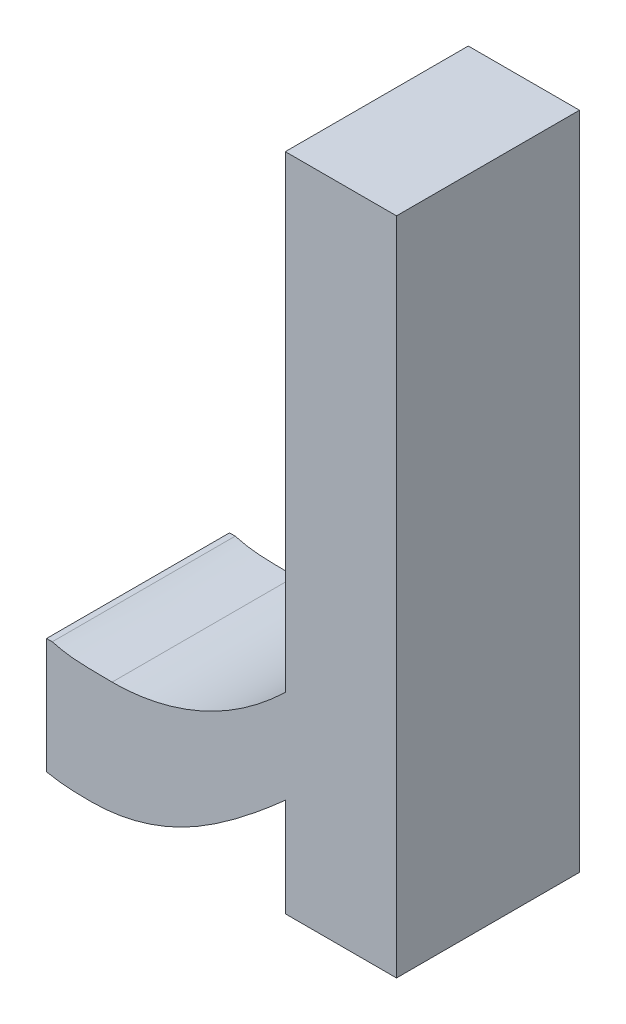
ISO-10303-21;
HEADER;
FILE_DESCRIPTION(('STEP AP214'),'2;1');
FILE_NAME('part.step','',(''),(''),'','','');
FILE_SCHEMA(('AUTOMOTIVE_DESIGN { 1 0 10303 214 1 1 1 1 }'));
ENDSEC;
DATA;
#1=APPLICATION_CONTEXT('core data for automotive mechanical design processes');
#2=APPLICATION_PROTOCOL_DEFINITION('international standard','automotive_design',2000,#1);
#3=PRODUCT_CONTEXT('',#1,'mechanical');
#4=PRODUCT('Part','Part','',(#3));
#5=PRODUCT_RELATED_PRODUCT_CATEGORY('part','',(#4));
#6=PRODUCT_DEFINITION_FORMATION('','',#4);
#7=PRODUCT_DEFINITION_CONTEXT('part definition',#1,'design');
#8=PRODUCT_DEFINITION('design','',#6,#7);
#9=PRODUCT_DEFINITION_SHAPE('','',#8);
#10=(LENGTH_UNIT() NAMED_UNIT(*) SI_UNIT(.MILLI.,.METRE.));
#11=(NAMED_UNIT(*) PLANE_ANGLE_UNIT() SI_UNIT($,.RADIAN.));
#12=(NAMED_UNIT(*) SI_UNIT($,.STERADIAN.) SOLID_ANGLE_UNIT());
#13=UNCERTAINTY_MEASURE_WITH_UNIT(LENGTH_MEASURE(1.E-05),#10,'distance_accuracy_value','');
#14=(GEOMETRIC_REPRESENTATION_CONTEXT(3) GLOBAL_UNCERTAINTY_ASSIGNED_CONTEXT((#13)) GLOBAL_UNIT_ASSIGNED_CONTEXT((#10,
#11,#12)) REPRESENTATION_CONTEXT('',''));
#15=CARTESIAN_POINT('',(0.,0.,0.));
#16=DIRECTION('',(0.,0.,1.));
#17=DIRECTION('',(1.,0.,0.));
#18=AXIS2_PLACEMENT_3D('',#15,#16,#17);
#19=CARTESIAN_POINT('',(-7.146569694468,-7.805310024976,0.));
#20=CARTESIAN_POINT('',(-7.146569694468,-7.805310024976,0.1));
#21=CARTESIAN_POINT('',(-7.157088081995,-7.805310024976,0.));
#22=CARTESIAN_POINT('',(-7.157088081995,-7.805310024976,0.1));
#23=CARTESIAN_POINT('',(-7.172281308424,-7.804530885159,0.));
#24=CARTESIAN_POINT('',(-7.172281308424,-7.804530885159,0.1));
#25=CARTESIAN_POINT('',(-7.179293566776,-7.802583035617,0.));
#26=CARTESIAN_POINT('',(-7.179293566776,-7.802583035617,0.1));
#27=B_SPLINE_SURFACE_WITH_KNOTS('',2,1,((#19,#20),(#21,#22),(#23,#24),(#25,#26)),.UNSPECIFIED.,
.F.,.F.,.F.,(3,1,3),(2,2),(-2.,-1.,0.),(0.,0.01),.UNSPECIFIED.);
#28=CARTESIAN_POINT('',(-7.179293566776,-7.802583035617,0.));
#29=CARTESIAN_POINT('',(-7.172281308424,-7.804530885159,0.));
#30=CARTESIAN_POINT('',(-7.157088081995,-7.805310024976,0.));
#31=CARTESIAN_POINT('',(-7.146569694468,-7.805310024976,0.));
#32=B_SPLINE_CURVE_WITH_KNOTS('',2,(#28,#29,#30,#31),.UNSPECIFIED.,.F.,.F.,(3,1,3),(0.,1.,2.),.UNSPECIFIED.);
#33=CARTESIAN_POINT('',(-7.179293566776,-7.802583035617,0.));
#34=VERTEX_POINT('',#33);
#35=CARTESIAN_POINT('',(-7.146569694468,-7.805310024976,0.));
#36=VERTEX_POINT('',#35);
#37=EDGE_CURVE('E11',#34,#36,#32,.T.);
#38=DIRECTION('',(0.,0.,1.));
#39=VECTOR('',#38,1.);
#40=CARTESIAN_POINT('',(-7.179293566776,-7.802583035617,0.));
#41=LINE('',#40,#39);
#42=CARTESIAN_POINT('',(-7.179293566776,-7.802583035617,0.1));
#43=VERTEX_POINT('',#42);
#44=EDGE_CURVE('E28',#34,#43,#41,.T.);
#45=CARTESIAN_POINT('',(-7.146569694468,-7.805310024976,0.1));
#46=CARTESIAN_POINT('',(-7.157088081995,-7.805310024976,0.1));
#47=CARTESIAN_POINT('',(-7.172281308424,-7.804530885159,0.1));
#48=CARTESIAN_POINT('',(-7.179293566776,-7.802583035617,0.1));
#49=B_SPLINE_CURVE_WITH_KNOTS('',2,(#45,#46,#47,#48),.UNSPECIFIED.,.F.,.F.,(3,1,3),(-2.,-1.,0.),.UNSPECIFIED.);
#50=CARTESIAN_POINT('',(-7.146569694468,-7.805310024976,0.1));
#51=VERTEX_POINT('',#50);
#52=EDGE_CURVE('E122',#51,#43,#49,.T.);
#53=DIRECTION('',(0.,0.,1.));
#54=VECTOR('',#53,1.);
#55=CARTESIAN_POINT('',(-7.146569694468,-7.805310024976,0.));
#56=LINE('',#55,#54);
#57=EDGE_CURVE('E214',#36,#51,#56,.T.);
#58=ORIENTED_EDGE('',*,*,#37,.F.);
#59=ORIENTED_EDGE('',*,*,#44,.T.);
#60=ORIENTED_EDGE('',*,*,#52,.F.);
#61=ORIENTED_EDGE('',*,*,#57,.F.);
#62=EDGE_LOOP('',(#58,#59,#60,#61));
#63=FACE_BOUND('',#62,.T.);
#64=ADVANCED_FACE('F17',(#63),#27,.T.);
#65=CARTESIAN_POINT('',(-7.051904206719,-7.762846904957,0.));
#66=CARTESIAN_POINT('',(-7.051904206719,-7.762846904957,0.1));
#67=CARTESIAN_POINT('',(-7.073720121591,-7.783883680012,0.));
#68=CARTESIAN_POINT('',(-7.073720121591,-7.783883680012,0.1));
#69=CARTESIAN_POINT('',(-7.122026790236,-7.805310024976,0.));
#70=CARTESIAN_POINT('',(-7.122026790236,-7.805310024976,0.1));
#71=CARTESIAN_POINT('',(-7.146569694468,-7.805310024976,0.));
#72=CARTESIAN_POINT('',(-7.146569694468,-7.805310024976,0.1));
#73=B_SPLINE_SURFACE_WITH_KNOTS('',2,1,((#65,#66),(#67,#68),(#69,#70),(#71,#72)),.UNSPECIFIED.,
.F.,.F.,.F.,(3,1,3),(2,2),(-2.,-1.,0.),(0.,0.01),.UNSPECIFIED.);
#74=CARTESIAN_POINT('',(-7.146569694468,-7.805310024976,0.));
#75=CARTESIAN_POINT('',(-7.122026790236,-7.805310024976,0.));
#76=CARTESIAN_POINT('',(-7.073720121591,-7.783883680012,0.));
#77=CARTESIAN_POINT('',(-7.051904206719,-7.762846904957,0.));
#78=B_SPLINE_CURVE_WITH_KNOTS('',2,(#74,#75,#76,#77),.UNSPECIFIED.,.F.,.F.,(3,1,3),(0.,1.,2.),.UNSPECIFIED.);
#79=CARTESIAN_POINT('',(-7.051904206719,-7.762846904957,0.));
#80=VERTEX_POINT('',#79);
#81=EDGE_CURVE('E207',#36,#80,#78,.T.);
#82=CARTESIAN_POINT('',(-7.051904206719,-7.762846904957,0.1));
#83=CARTESIAN_POINT('',(-7.073720121591,-7.783883680012,0.1));
#84=CARTESIAN_POINT('',(-7.122026790236,-7.805310024976,0.1));
#85=CARTESIAN_POINT('',(-7.146569694468,-7.805310024976,0.1));
#86=B_SPLINE_CURVE_WITH_KNOTS('',2,(#82,#83,#84,#85),.UNSPECIFIED.,.F.,.F.,(3,1,3),(-2.,-1.,0.),.UNSPECIFIED.);
#87=CARTESIAN_POINT('',(-7.051904206719,-7.762846904957,0.1));
#88=VERTEX_POINT('',#87);
#89=EDGE_CURVE('E203',#88,#51,#86,.T.);
#90=DIRECTION('',(0.,0.,1.));
#91=VECTOR('',#90,1.);
#92=CARTESIAN_POINT('',(-7.051904206719,-7.762846904957,0.));
#93=LINE('',#92,#91);
#94=EDGE_CURVE('E200',#80,#88,#93,.T.);
#95=ORIENTED_EDGE('',*,*,#81,.F.);
#96=ORIENTED_EDGE('',*,*,#57,.T.);
#97=ORIENTED_EDGE('',*,*,#89,.F.);
#98=ORIENTED_EDGE('',*,*,#94,.F.);
#99=EDGE_LOOP('',(#95,#96,#97,#98));
#100=FACE_BOUND('',#99,.T.);
#101=ADVANCED_FACE('F256',(#100),#73,.T.);
#102=CARTESIAN_POINT('',(-7.051904206719,-7.506899475119,0.));
#103=DIRECTION('',(-1.,0.,0.));
#104=DIRECTION('',(0.,-1.,0.));
#105=AXIS2_PLACEMENT_3D('',#102,#103,#104);
#106=PLANE('',#105);
#107=DIRECTION('',(0.,1.,0.));
#108=VECTOR('',#107,1.);
#109=CARTESIAN_POINT('',(-7.051904206719,-7.762846904957,0.));
#110=LINE('',#109,#108);
#111=CARTESIAN_POINT('',(-7.051904206719,-7.506899475119,0.));
#112=VERTEX_POINT('',#111);
#113=EDGE_CURVE('E198',#80,#112,#110,.T.);
#114=ORIENTED_EDGE('',*,*,#113,.F.);
#115=ORIENTED_EDGE('',*,*,#94,.T.);
#116=DIRECTION('',(0.,-1.,0.));
#117=VECTOR('',#116,1.);
#118=CARTESIAN_POINT('',(-7.051904206719,-7.762846904957,0.1));
#119=LINE('',#118,#117);
#120=CARTESIAN_POINT('',(-7.051904206719,-7.506899475119,0.1));
#121=VERTEX_POINT('',#120);
#122=EDGE_CURVE('E195',#121,#88,#119,.T.);
#123=ORIENTED_EDGE('',*,*,#122,.F.);
#124=DIRECTION('',(0.,0.,1.));
#125=VECTOR('',#124,1.);
#126=CARTESIAN_POINT('',(-7.051904206719,-7.506899475119,0.));
#127=LINE('',#126,#125);
#128=EDGE_CURVE('E192',#112,#121,#127,.T.);
#129=ORIENTED_EDGE('',*,*,#128,.F.);
#130=EDGE_LOOP('',(#114,#115,#123,#129));
#131=FACE_BOUND('',#130,.T.);
#132=ADVANCED_FACE('F252',(#131),#106,.T.);
#133=CARTESIAN_POINT('',(-6.991131301004,-7.506899475119,0.));
#134=DIRECTION('',(0.,1.,0.));
#135=DIRECTION('',(-1.,0.,0.));
#136=AXIS2_PLACEMENT_3D('',#133,#134,#135);
#137=PLANE('',#136);
#138=DIRECTION('',(1.,0.,0.));
#139=VECTOR('',#138,1.);
#140=CARTESIAN_POINT('',(-7.051904206719,-7.506899475119,0.));
#141=LINE('',#140,#139);
#142=CARTESIAN_POINT('',(-6.991131301004,-7.506899475119,0.));
#143=VERTEX_POINT('',#142);
#144=EDGE_CURVE('E190',#112,#143,#141,.T.);
#145=ORIENTED_EDGE('',*,*,#144,.F.);
#146=ORIENTED_EDGE('',*,*,#128,.T.);
#147=DIRECTION('',(-1.,0.,0.));
#148=VECTOR('',#147,1.);
#149=CARTESIAN_POINT('',(-7.051904206719,-7.506899475119,0.1));
#150=LINE('',#149,#148);
#151=CARTESIAN_POINT('',(-6.991131301004,-7.506899475119,0.1));
#152=VERTEX_POINT('',#151);
#153=EDGE_CURVE('E187',#152,#121,#150,.T.);
#154=ORIENTED_EDGE('',*,*,#153,.F.);
#155=DIRECTION('',(0.,0.,1.));
#156=VECTOR('',#155,1.);
#157=CARTESIAN_POINT('',(-6.991131301004,-7.506899475119,0.));
#158=LINE('',#157,#156);
#159=EDGE_CURVE('E184',#143,#152,#158,.T.);
#160=ORIENTED_EDGE('',*,*,#159,.F.);
#161=EDGE_LOOP('',(#145,#146,#154,#160));
#162=FACE_BOUND('',#161,.T.);
#163=ADVANCED_FACE('F248',(#162),#137,.T.);
#164=CARTESIAN_POINT('',(-6.991131301004,-7.867641210324,0.));
#165=DIRECTION('',(1.,0.,0.));
#166=DIRECTION('',(0.,1.,0.));
#167=AXIS2_PLACEMENT_3D('',#164,#165,#166);
#168=PLANE('',#167);
#169=DIRECTION('',(0.,-1.,0.));
#170=VECTOR('',#169,1.);
#171=CARTESIAN_POINT('',(-6.991131301004,-7.506899475119,0.));
#172=LINE('',#171,#170);
#173=CARTESIAN_POINT('',(-6.991131301004,-7.867641210324,0.));
#174=VERTEX_POINT('',#173);
#175=EDGE_CURVE('E182',#143,#174,#172,.T.);
#176=ORIENTED_EDGE('',*,*,#175,.F.);
#177=ORIENTED_EDGE('',*,*,#159,.T.);
#178=DIRECTION('',(0.,1.,0.));
#179=VECTOR('',#178,1.);
#180=CARTESIAN_POINT('',(-6.991131301004,-7.506899475119,0.1));
#181=LINE('',#180,#179);
#182=CARTESIAN_POINT('',(-6.991131301004,-7.867641210324,0.1));
#183=VERTEX_POINT('',#182);
#184=EDGE_CURVE('E179',#183,#152,#181,.T.);
#185=ORIENTED_EDGE('',*,*,#184,.F.);
#186=DIRECTION('',(0.,0.,1.));
#187=VECTOR('',#186,1.);
#188=CARTESIAN_POINT('',(-6.991131301004,-7.867641210324,0.));
#189=LINE('',#188,#187);
#190=EDGE_CURVE('E176',#174,#183,#189,.T.);
#191=ORIENTED_EDGE('',*,*,#190,.F.);
#192=EDGE_LOOP('',(#176,#177,#185,#191));
#193=FACE_BOUND('',#192,.T.);
#194=ADVANCED_FACE('F244',(#193),#168,.T.);
#195=CARTESIAN_POINT('',(-7.051904206719,-7.867641210324,0.));
#196=DIRECTION('',(0.,-1.,0.));
#197=DIRECTION('',(1.,0.,0.));
#198=AXIS2_PLACEMENT_3D('',#195,#196,#197);
#199=PLANE('',#198);
#200=DIRECTION('',(-1.,0.,0.));
#201=VECTOR('',#200,1.);
#202=CARTESIAN_POINT('',(-6.991131301004,-7.867641210324,0.));
#203=LINE('',#202,#201);
#204=CARTESIAN_POINT('',(-7.051904206719,-7.867641210324,0.));
#205=VERTEX_POINT('',#204);
#206=EDGE_CURVE('E174',#174,#205,#203,.T.);
#207=ORIENTED_EDGE('',*,*,#206,.F.);
#208=ORIENTED_EDGE('',*,*,#190,.T.);
#209=DIRECTION('',(1.,0.,0.));
#210=VECTOR('',#209,1.);
#211=CARTESIAN_POINT('',(-6.991131301004,-7.867641210324,0.1));
#212=LINE('',#211,#210);
#213=CARTESIAN_POINT('',(-7.051904206719,-7.867641210324,0.1));
#214=VERTEX_POINT('',#213);
#215=EDGE_CURVE('E171',#214,#183,#212,.T.);
#216=ORIENTED_EDGE('',*,*,#215,.F.);
#217=DIRECTION('',(0.,0.,1.));
#218=VECTOR('',#217,1.);
#219=CARTESIAN_POINT('',(-7.051904206719,-7.867641210324,0.));
#220=LINE('',#219,#218);
#221=EDGE_CURVE('E168',#205,#214,#220,.T.);
#222=ORIENTED_EDGE('',*,*,#221,.F.);
#223=EDGE_LOOP('',(#207,#208,#216,#222));
#224=FACE_BOUND('',#223,.T.);
#225=ADVANCED_FACE('F240',(#224),#199,.T.);
#226=CARTESIAN_POINT('',(-7.051904206719,-7.813880562961,0.));
#227=DIRECTION('',(-1.,0.,0.));
#228=DIRECTION('',(0.,-1.,0.));
#229=AXIS2_PLACEMENT_3D('',#226,#227,#228);
#230=PLANE('',#229);
#231=DIRECTION('',(0.,1.,0.));
#232=VECTOR('',#231,1.);
#233=CARTESIAN_POINT('',(-7.051904206719,-7.867641210324,0.));
#234=LINE('',#233,#232);
#235=CARTESIAN_POINT('',(-7.051904206719,-7.813880562961,0.));
#236=VERTEX_POINT('',#235);
#237=EDGE_CURVE('E166',#205,#236,#234,.T.);
#238=ORIENTED_EDGE('',*,*,#237,.F.);
#239=ORIENTED_EDGE('',*,*,#221,.T.);
#240=DIRECTION('',(0.,-1.,0.));
#241=VECTOR('',#240,1.);
#242=CARTESIAN_POINT('',(-7.051904206719,-7.867641210324,0.1));
#243=LINE('',#242,#241);
#244=CARTESIAN_POINT('',(-7.051904206719,-7.813880562961,0.1));
#245=VERTEX_POINT('',#244);
#246=EDGE_CURVE('E163',#245,#214,#243,.T.);
#247=ORIENTED_EDGE('',*,*,#246,.F.);
#248=DIRECTION('',(0.,0.,1.));
#249=VECTOR('',#248,1.);
#250=CARTESIAN_POINT('',(-7.051904206719,-7.813880562961,0.));
#251=LINE('',#250,#249);
#252=EDGE_CURVE('E157',#236,#245,#251,.T.);
#253=ORIENTED_EDGE('',*,*,#252,.F.);
#254=EDGE_LOOP('',(#238,#239,#247,#253));
#255=FACE_BOUND('',#254,.T.);
#256=ADVANCED_FACE('F236',(#255),#230,.T.);
#257=CARTESIAN_POINT('',(-7.157867221812,-7.867641210324,0.));
#258=CARTESIAN_POINT('',(-7.157867221812,-7.867641210324,0.1));
#259=CARTESIAN_POINT('',(-7.134493027306,-7.867641210324,0.));
#260=CARTESIAN_POINT('',(-7.134493027306,-7.867641210324,0.1));
#261=CARTESIAN_POINT('',(-7.085017648936,-7.843487876002,0.));
#262=CARTESIAN_POINT('',(-7.085017648936,-7.843487876002,0.1));
#263=CARTESIAN_POINT('',(-7.051904206719,-7.813880562961,0.));
#264=CARTESIAN_POINT('',(-7.051904206719,-7.813880562961,0.1));
#265=B_SPLINE_SURFACE_WITH_KNOTS('',2,1,((#257,#258),(#259,#260),(#261,#262),(#263,#264)),
.UNSPECIFIED.,.F.,.F.,.F.,(3,1,3),(2,2),(-2.,-1.,0.),(0.,0.01),.UNSPECIFIED.);
#266=CARTESIAN_POINT('',(-7.051904206719,-7.813880562961,0.));
#267=CARTESIAN_POINT('',(-7.085017648936,-7.843487876002,0.));
#268=CARTESIAN_POINT('',(-7.134493027306,-7.867641210324,0.));
#269=CARTESIAN_POINT('',(-7.157867221812,-7.867641210324,0.));
#270=B_SPLINE_CURVE_WITH_KNOTS('',2,(#266,#267,#268,#269),.UNSPECIFIED.,.F.,.F.,(3,1,3),(0.,1.,
2.),.UNSPECIFIED.);
#271=CARTESIAN_POINT('',(-7.157867221812,-7.867641210324,0.));
#272=VERTEX_POINT('',#271);
#273=EDGE_CURVE('E150',#236,#272,#270,.T.);
#274=CARTESIAN_POINT('',(-7.157867221812,-7.867641210324,0.1));
#275=CARTESIAN_POINT('',(-7.134493027306,-7.867641210324,0.1));
#276=CARTESIAN_POINT('',(-7.085017648936,-7.843487876002,0.1));
#277=CARTESIAN_POINT('',(-7.051904206719,-7.813880562961,0.1));
#278=B_SPLINE_CURVE_WITH_KNOTS('',2,(#274,#275,#276,#277),.UNSPECIFIED.,.F.,.F.,(3,1,3),(-2.,
-1.,0.),.UNSPECIFIED.);
#279=CARTESIAN_POINT('',(-7.157867221812,-7.867641210324,0.1));
#280=VERTEX_POINT('',#279);
#281=EDGE_CURVE('E145',#280,#245,#278,.T.);
#282=DIRECTION('',(0.,0.,1.));
#283=VECTOR('',#282,1.);
#284=CARTESIAN_POINT('',(-7.157867221812,-7.867641210324,0.));
#285=LINE('',#284,#283);
#286=EDGE_CURVE('E139',#272,#280,#285,.T.);
#287=ORIENTED_EDGE('',*,*,#273,.F.);
#288=ORIENTED_EDGE('',*,*,#252,.T.);
#289=ORIENTED_EDGE('',*,*,#281,.F.);
#290=ORIENTED_EDGE('',*,*,#286,.F.);
#291=EDGE_LOOP('',(#287,#288,#289,#290));
#292=FACE_BOUND('',#291,.T.);
#293=ADVANCED_FACE('F232',(#292),#265,.T.);
#294=CARTESIAN_POINT('',(-7.182410126043,-7.865693360782,0.));
#295=CARTESIAN_POINT('',(-7.182410126043,-7.865693360782,0.1));
#296=CARTESIAN_POINT('',(-7.176566577417,-7.866862070508,0.));
#297=CARTESIAN_POINT('',(-7.176566577417,-7.866862070508,0.1));
#298=CARTESIAN_POINT('',(-7.167216899614,-7.867641210324,0.));
#299=CARTESIAN_POINT('',(-7.167216899614,-7.867641210324,0.1));
#300=CARTESIAN_POINT('',(-7.157867221812,-7.867641210324,0.));
#301=CARTESIAN_POINT('',(-7.157867221812,-7.867641210324,0.1));
#302=B_SPLINE_SURFACE_WITH_KNOTS('',2,1,((#294,#295),(#296,#297),(#298,#299),(#300,#301)),
.UNSPECIFIED.,.F.,.F.,.F.,(3,1,3),(2,2),(-2.,-1.,0.),(0.,0.01),.UNSPECIFIED.);
#303=CARTESIAN_POINT('',(-7.157867221812,-7.867641210324,0.));
#304=CARTESIAN_POINT('',(-7.167216899614,-7.867641210324,0.));
#305=CARTESIAN_POINT('',(-7.176566577417,-7.866862070508,0.));
#306=CARTESIAN_POINT('',(-7.182410126043,-7.865693360782,0.));
#307=B_SPLINE_CURVE_WITH_KNOTS('',2,(#303,#304,#305,#306),.UNSPECIFIED.,.F.,.F.,(3,1,3),(0.,1.,
2.),.UNSPECIFIED.);
#308=CARTESIAN_POINT('',(-7.182410126043,-7.865693360782,0.));
#309=VERTEX_POINT('',#308);
#310=EDGE_CURVE('E132',#272,#309,#307,.T.);
#311=CARTESIAN_POINT('',(-7.182410126043,-7.865693360782,0.1));
#312=CARTESIAN_POINT('',(-7.176566577417,-7.866862070508,0.1));
#313=CARTESIAN_POINT('',(-7.167216899614,-7.867641210324,0.1));
#314=CARTESIAN_POINT('',(-7.157867221812,-7.867641210324,0.1));
#315=B_SPLINE_CURVE_WITH_KNOTS('',2,(#311,#312,#313,#314),.UNSPECIFIED.,.F.,.F.,(3,1,3),(-2.,
-1.,0.),.UNSPECIFIED.);
#316=CARTESIAN_POINT('',(-7.182410126043,-7.865693360782,0.1));
#317=VERTEX_POINT('',#316);
#318=EDGE_CURVE('E128',#317,#280,#315,.T.);
#319=DIRECTION('',(0.,0.,1.));
#320=VECTOR('',#319,1.);
#321=CARTESIAN_POINT('',(-7.182410126043,-7.865693360782,0.));
#322=LINE('',#321,#320);
#323=EDGE_CURVE('E107',#309,#317,#322,.T.);
#324=ORIENTED_EDGE('',*,*,#310,.F.);
#325=ORIENTED_EDGE('',*,*,#286,.T.);
#326=ORIENTED_EDGE('',*,*,#318,.F.);
#327=ORIENTED_EDGE('',*,*,#323,.F.);
#328=EDGE_LOOP('',(#324,#325,#326,#327));
#329=FACE_BOUND('',#328,.T.);
#330=ADVANCED_FACE('F230',(#329),#302,.T.);
#331=CARTESIAN_POINT('',(-7.182410126043,-7.802583035617,0.));
#332=DIRECTION('',(-1.,0.,0.));
#333=DIRECTION('',(0.,-1.,0.));
#334=AXIS2_PLACEMENT_3D('',#331,#332,#333);
#335=PLANE('',#334);
#336=DIRECTION('',(0.,1.,0.));
#337=VECTOR('',#336,1.);
#338=CARTESIAN_POINT('',(-7.182410126043,-7.865693360782,0.));
#339=LINE('',#338,#337);
#340=CARTESIAN_POINT('',(-7.182410126043,-7.802583035617,0.));
#341=VERTEX_POINT('',#340);
#342=EDGE_CURVE('E111',#309,#341,#339,.T.);
#343=ORIENTED_EDGE('',*,*,#342,.F.);
#344=ORIENTED_EDGE('',*,*,#323,.T.);
#345=DIRECTION('',(0.,-1.,0.));
#346=VECTOR('',#345,1.);
#347=CARTESIAN_POINT('',(-7.182410126043,-7.865693360782,0.1));
#348=LINE('',#347,#346);
#349=CARTESIAN_POINT('',(-7.182410126043,-7.802583035617,0.1));
#350=VERTEX_POINT('',#349);
#351=EDGE_CURVE('E100',#350,#317,#348,.T.);
#352=ORIENTED_EDGE('',*,*,#351,.F.);
#353=DIRECTION('',(0.,0.,1.));
#354=VECTOR('',#353,1.);
#355=CARTESIAN_POINT('',(-7.182410126043,-7.802583035617,0.));
#356=LINE('',#355,#354);
#357=EDGE_CURVE('E104',#341,#350,#356,.T.);
#358=ORIENTED_EDGE('',*,*,#357,.F.);
#359=EDGE_LOOP('',(#343,#344,#352,#358));
#360=FACE_BOUND('',#359,.T.);
#361=ADVANCED_FACE('F103',(#360),#335,.T.);
#362=CARTESIAN_POINT('',(-7.179293566776,-7.802583035617,0.));
#363=DIRECTION('',(0.,1.,0.));
#364=DIRECTION('',(-1.,0.,0.));
#365=AXIS2_PLACEMENT_3D('',#362,#363,#364);
#366=PLANE('',#365);
#367=DIRECTION('',(1.,0.,0.));
#368=VECTOR('',#367,1.);
#369=CARTESIAN_POINT('',(-7.182410126043,-7.802583035617,0.));
#370=LINE('',#369,#368);
#371=EDGE_CURVE('E117',#341,#34,#370,.T.);
#372=ORIENTED_EDGE('',*,*,#371,.F.);
#373=ORIENTED_EDGE('',*,*,#357,.T.);
#374=DIRECTION('',(-1.,0.,0.));
#375=VECTOR('',#374,1.);
#376=CARTESIAN_POINT('',(-7.182410126043,-7.802583035617,0.1));
#377=LINE('',#376,#375);
#378=EDGE_CURVE('E116',#43,#350,#377,.T.);
#379=ORIENTED_EDGE('',*,*,#378,.F.);
#380=ORIENTED_EDGE('',*,*,#44,.F.);
#381=EDGE_LOOP('',(#372,#373,#379,#380));
#382=FACE_BOUND('',#381,.T.);
#383=ADVANCED_FACE('F115',(#382),#366,.T.);
#384=CARTESIAN_POINT('',(-7.048249209046,-7.718512782706,0.));
#385=DIRECTION('',(0.,0.,1.));
#386=DIRECTION('',(1.,0.,0.));
#387=AXIS2_PLACEMENT_3D('',#384,#385,#386);
#388=PLANE('',#387);
#389=ORIENTED_EDGE('',*,*,#371,.T.);
#390=ORIENTED_EDGE('',*,*,#37,.T.);
#391=ORIENTED_EDGE('',*,*,#81,.T.);
#392=ORIENTED_EDGE('',*,*,#113,.T.);
#393=ORIENTED_EDGE('',*,*,#144,.T.);
#394=ORIENTED_EDGE('',*,*,#175,.T.);
#395=ORIENTED_EDGE('',*,*,#206,.T.);
#396=ORIENTED_EDGE('',*,*,#237,.T.);
#397=ORIENTED_EDGE('',*,*,#273,.T.);
#398=ORIENTED_EDGE('',*,*,#310,.T.);
#399=ORIENTED_EDGE('',*,*,#342,.T.);
#400=EDGE_LOOP('',(#389,#390,#391,#392,#393,#394,#395,#396,#397,#398,#399));
#401=FACE_BOUND('',#400,.T.);
#402=ADVANCED_FACE('F225',(#401),#388,.F.);
#403=CARTESIAN_POINT('',(-7.048249209046,-7.718512782706,0.1));
#404=DIRECTION('',(0.,0.,1.));
#405=DIRECTION('',(1.,0.,0.));
#406=AXIS2_PLACEMENT_3D('',#403,#404,#405);
#407=PLANE('',#406);
#408=ORIENTED_EDGE('',*,*,#378,.T.);
#409=ORIENTED_EDGE('',*,*,#351,.T.);
#410=ORIENTED_EDGE('',*,*,#318,.T.);
#411=ORIENTED_EDGE('',*,*,#281,.T.);
#412=ORIENTED_EDGE('',*,*,#246,.T.);
#413=ORIENTED_EDGE('',*,*,#215,.T.);
#414=ORIENTED_EDGE('',*,*,#184,.T.);
#415=ORIENTED_EDGE('',*,*,#153,.T.);
#416=ORIENTED_EDGE('',*,*,#122,.T.);
#417=ORIENTED_EDGE('',*,*,#89,.T.);
#418=ORIENTED_EDGE('',*,*,#52,.T.);
#419=EDGE_LOOP('',(#408,#409,#410,#411,#412,#413,#414,#415,#416,#417,#418));
#420=FACE_BOUND('',#419,.T.);
#421=ADVANCED_FACE('F120',(#420),#407,.T.);
#422=CLOSED_SHELL('',(#64,#101,#132,#163,#194,#225,#256,#293,#330,#361,#383,#402,#421));
#423=MANIFOLD_SOLID_BREP('B1',#422);
#424=ADVANCED_BREP_SHAPE_REPRESENTATION('',(#18,#423),#14);
#425=SHAPE_DEFINITION_REPRESENTATION(#9,#424);
ENDSEC;
END-ISO-10303-21;
